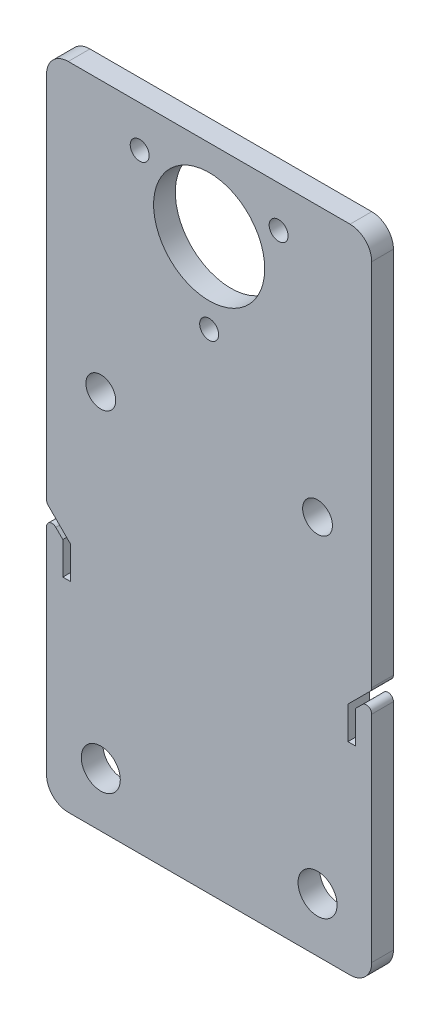
ISO-10303-21;
HEADER;
FILE_DESCRIPTION(('STEP AP214'),'2;1');
FILE_NAME('part.step','',(''),(''),'','','');
FILE_SCHEMA(('AUTOMOTIVE_DESIGN { 1 0 10303 214 1 1 1 1 }'));
ENDSEC;
DATA;
#1=APPLICATION_CONTEXT('core data for automotive mechanical design processes');
#2=APPLICATION_PROTOCOL_DEFINITION('international standard','automotive_design',2000,#1);
#3=PRODUCT_CONTEXT('',#1,'mechanical');
#4=PRODUCT('Part','Part','',(#3));
#5=PRODUCT_RELATED_PRODUCT_CATEGORY('part','',(#4));
#6=PRODUCT_DEFINITION_FORMATION('','',#4);
#7=PRODUCT_DEFINITION_CONTEXT('part definition',#1,'design');
#8=PRODUCT_DEFINITION('design','',#6,#7);
#9=PRODUCT_DEFINITION_SHAPE('','',#8);
#10=(LENGTH_UNIT() NAMED_UNIT(*) SI_UNIT(.MILLI.,.METRE.));
#11=(NAMED_UNIT(*) PLANE_ANGLE_UNIT() SI_UNIT($,.RADIAN.));
#12=(NAMED_UNIT(*) SI_UNIT($,.STERADIAN.) SOLID_ANGLE_UNIT());
#13=UNCERTAINTY_MEASURE_WITH_UNIT(LENGTH_MEASURE(1.E-05),#10,'distance_accuracy_value','');
#14=(GEOMETRIC_REPRESENTATION_CONTEXT(3) GLOBAL_UNCERTAINTY_ASSIGNED_CONTEXT((#13)) GLOBAL_UNIT_ASSIGNED_CONTEXT((#10,
#11,#12)) REPRESENTATION_CONTEXT('',''));
#15=CARTESIAN_POINT('',(0.,0.,0.));
#16=DIRECTION('',(0.,0.,1.));
#17=DIRECTION('',(1.,0.,0.));
#18=AXIS2_PLACEMENT_3D('',#15,#16,#17);
#19=CARTESIAN_POINT('',(0.,0.,4.));
#20=DIRECTION('',(0.,0.,-1.));
#21=DIRECTION('',(-1.,0.,0.));
#22=AXIS2_PLACEMENT_3D('',#19,#20,#21);
#23=PLANE('',#22);
#24=CARTESIAN_POINT('',(-0.884068038830248,45.7063351268432,4.));
#25=DIRECTION('',(0.,0.,1.));
#26=DIRECTION('',(1.,0.,0.));
#27=AXIS2_PLACEMENT_3D('',#24,#25,#26);
#28=CIRCLE('',#27,2.75);
#29=CARTESIAN_POINT('',(1.86593196116975,45.7063351268432,4.));
#30=VERTEX_POINT('',#29);
#31=EDGE_CURVE('E304',#30,#30,#28,.T.);
#32=ORIENTED_EDGE('',*,*,#31,.F.);
#33=EDGE_LOOP('',(#32));
#34=FACE_BOUND('',#33,.T.);
#35=CARTESIAN_POINT('',(-0.884068038830246,-14.4936648731568,4.));
#36=DIRECTION('',(0.,0.,1.));
#37=DIRECTION('',(1.,0.,0.));
#38=AXIS2_PLACEMENT_3D('',#35,#36,#37);
#39=CIRCLE('',#38,3.6);
#40=CARTESIAN_POINT('',(2.71593196116975,-14.4936648731568,4.));
#41=VERTEX_POINT('',#40);
#42=EDGE_CURVE('E298',#41,#41,#39,.T.);
#43=ORIENTED_EDGE('',*,*,#42,.F.);
#44=EDGE_LOOP('',(#43));
#45=FACE_BOUND('',#44,.T.);
#46=CARTESIAN_POINT('',(39.1159319611697,-14.4936648731568,4.));
#47=DIRECTION('',(0.,0.,1.));
#48=DIRECTION('',(1.,0.,0.));
#49=AXIS2_PLACEMENT_3D('',#46,#47,#48);
#50=CIRCLE('',#49,3.6);
#51=CARTESIAN_POINT('',(42.7159319611697,-14.4936648731568,4.));
#52=VERTEX_POINT('',#51);
#53=EDGE_CURVE('E292',#52,#52,#50,.T.);
#54=ORIENTED_EDGE('',*,*,#53,.F.);
#55=EDGE_LOOP('',(#54));
#56=FACE_BOUND('',#55,.T.);
#57=CARTESIAN_POINT('',(39.1159319611697,45.7063351268432,4.));
#58=DIRECTION('',(0.,0.,1.));
#59=DIRECTION('',(1.,0.,0.));
#60=AXIS2_PLACEMENT_3D('',#57,#58,#59);
#61=CIRCLE('',#60,2.75);
#62=CARTESIAN_POINT('',(41.8659319611697,45.7063351268432,4.));
#63=VERTEX_POINT('',#62);
#64=EDGE_CURVE('E286',#63,#63,#61,.T.);
#65=ORIENTED_EDGE('',*,*,#64,.F.);
#66=EDGE_LOOP('',(#65));
#67=FACE_BOUND('',#66,.T.);
#68=CARTESIAN_POINT('',(19.1159319611697,80.5063351268432,4.));
#69=DIRECTION('',(0.,0.,1.));
#70=DIRECTION('',(1.,0.,0.));
#71=AXIS2_PLACEMENT_3D('',#68,#69,#70);
#72=CIRCLE('',#71,10.25);
#73=CARTESIAN_POINT('',(29.3659319611697,80.5063351268432,4.));
#74=VERTEX_POINT('',#73);
#75=EDGE_CURVE('E280',#74,#74,#72,.T.);
#76=ORIENTED_EDGE('',*,*,#75,.F.);
#77=EDGE_LOOP('',(#76));
#78=FACE_BOUND('',#77,.T.);
#79=CARTESIAN_POINT('',(6.29875598516008,87.9063351268432,4.));
#80=DIRECTION('',(0.,0.,1.));
#81=DIRECTION('',(1.,0.,0.));
#82=AXIS2_PLACEMENT_3D('',#79,#80,#81);
#83=CIRCLE('',#82,1.75000000000001);
#84=CARTESIAN_POINT('',(8.0487559851601,87.9063351268432,4.));
#85=VERTEX_POINT('',#84);
#86=EDGE_CURVE('E274',#85,#85,#83,.T.);
#87=ORIENTED_EDGE('',*,*,#86,.F.);
#88=EDGE_LOOP('',(#87));
#89=FACE_BOUND('',#88,.T.);
#90=CARTESIAN_POINT('',(31.9331079371794,87.9063351268432,4.));
#91=DIRECTION('',(0.,0.,1.));
#92=DIRECTION('',(1.,0.,0.));
#93=AXIS2_PLACEMENT_3D('',#90,#91,#92);
#94=CIRCLE('',#93,1.75);
#95=CARTESIAN_POINT('',(33.6831079371794,87.9063351268432,4.));
#96=VERTEX_POINT('',#95);
#97=EDGE_CURVE('E268',#96,#96,#94,.T.);
#98=ORIENTED_EDGE('',*,*,#97,.F.);
#99=EDGE_LOOP('',(#98));
#100=FACE_BOUND('',#99,.T.);
#101=CARTESIAN_POINT('',(19.1159319611697,65.7063351268432,4.));
#102=DIRECTION('',(0.,0.,1.));
#103=DIRECTION('',(1.,0.,0.));
#104=AXIS2_PLACEMENT_3D('',#101,#102,#103);
#105=CIRCLE('',#104,1.75);
#106=CARTESIAN_POINT('',(20.8659319611698,65.7063351268432,4.));
#107=VERTEX_POINT('',#106);
#108=EDGE_CURVE('E262',#107,#107,#105,.T.);
#109=ORIENTED_EDGE('',*,*,#108,.F.);
#110=EDGE_LOOP('',(#109));
#111=FACE_BOUND('',#110,.T.);
#112=DIRECTION('',(0.,-1.,0.));
#113=VECTOR('',#112,1.);
#114=CARTESIAN_POINT('',(-10.8840680388302,-24.4936648731568,4.));
#115=LINE('',#114,#113);
#116=CARTESIAN_POINT('',(-10.8840680388302,91.5063351268432,4.));
#117=VERTEX_POINT('',#116);
#118=CARTESIAN_POINT('',(-10.8840680388302,23.4205486892163,4.));
#119=VERTEX_POINT('',#118);
#120=EDGE_CURVE('E310',#117,#119,#115,.T.);
#121=ORIENTED_EDGE('',*,*,#120,.T.);
#122=CARTESIAN_POINT('',(-9.88406803883025,23.4205486892163,4.));
#123=DIRECTION('',(0.,0.,-1.));
#124=DIRECTION('',(-1.,0.,0.));
#125=AXIS2_PLACEMENT_3D('',#122,#123,#124);
#126=CIRCLE('',#125,1.);
#127=CARTESIAN_POINT('',(-10.5911748200168,22.7134419080298,4.));
#128=VERTEX_POINT('',#127);
#129=EDGE_CURVE('E199',#119,#128,#126,.F.);
#130=ORIENTED_EDGE('',*,*,#129,.T.);
#131=DIRECTION('',(0.707106781186544,-0.707106781186551,0.));
#132=VECTOR('',#131,1.);
#133=CARTESIAN_POINT('',(6.06113354400643,6.06113354400636,4.));
#134=LINE('',#133,#132);
#135=CARTESIAN_POINT('',(-6.48406803883025,18.6063351268432,4.));
#136=VERTEX_POINT('',#135);
#137=EDGE_CURVE('E192',#128,#136,#134,.T.);
#138=ORIENTED_EDGE('',*,*,#137,.T.);
#139=DIRECTION('',(0.,-1.,0.));
#140=VECTOR('',#139,1.);
#141=CARTESIAN_POINT('',(-6.48406803883025,0.,4.));
#142=LINE('',#141,#140);
#143=CARTESIAN_POINT('',(-6.48406803883025,12.6063351268432,4.));
#144=VERTEX_POINT('',#143);
#145=EDGE_CURVE('E197',#136,#144,#142,.T.);
#146=ORIENTED_EDGE('',*,*,#145,.T.);
#147=DIRECTION('',(1.,0.,0.));
#148=VECTOR('',#147,1.);
#149=CARTESIAN_POINT('',(0.,12.6063351268432,4.));
#150=LINE('',#149,#148);
#151=CARTESIAN_POINT('',(-7.88406803883025,12.6063351268432,4.));
#152=VERTEX_POINT('',#151);
#153=EDGE_CURVE('E213',#152,#144,#150,.T.);
#154=ORIENTED_EDGE('',*,*,#153,.F.);
#155=DIRECTION('',(0.,-1.,0.));
#156=VECTOR('',#155,1.);
#157=CARTESIAN_POINT('',(-7.88406803883025,0.,4.));
#158=LINE('',#157,#156);
#159=CARTESIAN_POINT('',(-7.88406803883025,18.6063351268432,4.));
#160=VERTEX_POINT('',#159);
#161=EDGE_CURVE('E226',#160,#152,#158,.T.);
#162=ORIENTED_EDGE('',*,*,#161,.F.);
#163=DIRECTION('',(-0.707106781186544,0.707106781186551,0.));
#164=VECTOR('',#163,1.);
#165=CARTESIAN_POINT('',(5.36113354400642,5.36113354400637,4.));
#166=LINE('',#165,#164);
#167=CARTESIAN_POINT('',(-9.1769612576437,19.8992283456566,4.));
#168=VERTEX_POINT('',#167);
#169=EDGE_CURVE('E203',#160,#168,#166,.T.);
#170=ORIENTED_EDGE('',*,*,#169,.T.);
#171=CARTESIAN_POINT('',(-9.88406803883025,19.1921215644701,4.));
#172=DIRECTION('',(0.,0.,-1.));
#173=DIRECTION('',(-1.,0.,0.));
#174=AXIS2_PLACEMENT_3D('',#171,#172,#173);
#175=CIRCLE('',#174,1.);
#176=CARTESIAN_POINT('',(-10.8840680388302,19.1921215644701,4.));
#177=VERTEX_POINT('',#176);
#178=EDGE_CURVE('E48',#168,#177,#175,.F.);
#179=ORIENTED_EDGE('',*,*,#178,.T.);
#180=CARTESIAN_POINT('',(-10.8840680388302,-20.4936648731568,4.));
#181=VERTEX_POINT('',#180);
#182=EDGE_CURVE('E313',#177,#181,#115,.T.);
#183=ORIENTED_EDGE('',*,*,#182,.T.);
#184=CARTESIAN_POINT('',(-6.88406803883025,-20.4936648731568,4.));
#185=DIRECTION('',(0.,0.,-1.));
#186=DIRECTION('',(-1.,0.,0.));
#187=AXIS2_PLACEMENT_3D('',#184,#185,#186);
#188=CIRCLE('',#187,4.);
#189=CARTESIAN_POINT('',(-6.88406803883025,-24.4936648731568,4.));
#190=VERTEX_POINT('',#189);
#191=EDGE_CURVE('E359',#181,#190,#188,.F.);
#192=ORIENTED_EDGE('',*,*,#191,.T.);
#193=DIRECTION('',(1.,0.,0.));
#194=VECTOR('',#193,1.);
#195=CARTESIAN_POINT('',(-10.8840680388302,-24.4936648731568,4.));
#196=LINE('',#195,#194);
#197=CARTESIAN_POINT('',(45.1159319611697,-24.4936648731568,4.));
#198=VERTEX_POINT('',#197);
#199=EDGE_CURVE('E312',#190,#198,#196,.T.);
#200=ORIENTED_EDGE('',*,*,#199,.T.);
#201=CARTESIAN_POINT('',(45.1159319611697,-20.4936648731568,4.));
#202=DIRECTION('',(0.,0.,-1.));
#203=DIRECTION('',(-1.,0.,0.));
#204=AXIS2_PLACEMENT_3D('',#201,#202,#203);
#205=CIRCLE('',#204,4.);
#206=CARTESIAN_POINT('',(49.1159319611697,-20.4936648731568,4.));
#207=VERTEX_POINT('',#206);
#208=EDGE_CURVE('E361',#198,#207,#205,.F.);
#209=ORIENTED_EDGE('',*,*,#208,.T.);
#210=DIRECTION('',(0.,1.,0.));
#211=VECTOR('',#210,1.);
#212=CARTESIAN_POINT('',(49.1159319611697,-24.4936648731568,4.));
#213=LINE('',#212,#211);
#214=CARTESIAN_POINT('',(49.1159319611697,19.1921215644701,4.));
#215=VERTEX_POINT('',#214);
#216=EDGE_CURVE('E317',#207,#215,#213,.T.);
#217=ORIENTED_EDGE('',*,*,#216,.T.);
#218=CARTESIAN_POINT('',(48.1159319611697,19.1921215644701,4.));
#219=DIRECTION('',(0.,0.,-1.));
#220=DIRECTION('',(-1.,0.,0.));
#221=AXIS2_PLACEMENT_3D('',#218,#219,#220);
#222=CIRCLE('',#221,1.);
#223=CARTESIAN_POINT('',(47.4088251799832,19.8992283456566,4.));
#224=VERTEX_POINT('',#223);
#225=EDGE_CURVE('E402',#215,#224,#222,.F.);
#226=ORIENTED_EDGE('',*,*,#225,.T.);
#227=DIRECTION('',(-0.707106781186548,-0.707106781186547,0.));
#228=VECTOR('',#227,1.);
#229=CARTESIAN_POINT('',(13.7547984171632,-13.7547984171633,4.));
#230=LINE('',#229,#228);
#231=CARTESIAN_POINT('',(46.1159319611697,18.6063351268432,4.));
#232=VERTEX_POINT('',#231);
#233=EDGE_CURVE('E247',#224,#232,#230,.T.);
#234=ORIENTED_EDGE('',*,*,#233,.T.);
#235=DIRECTION('',(0.,-1.,0.));
#236=VECTOR('',#235,1.);
#237=CARTESIAN_POINT('',(46.1159319611697,0.,4.));
#238=LINE('',#237,#236);
#239=CARTESIAN_POINT('',(46.1159319611697,12.6063351268432,4.));
#240=VERTEX_POINT('',#239);
#241=EDGE_CURVE('E244',#232,#240,#238,.T.);
#242=ORIENTED_EDGE('',*,*,#241,.T.);
#243=DIRECTION('',(1.,0.,0.));
#244=VECTOR('',#243,1.);
#245=CARTESIAN_POINT('',(0.,12.6063351268431,4.));
#246=LINE('',#245,#244);
#247=CARTESIAN_POINT('',(44.7159319611698,12.6063351268432,4.));
#248=VERTEX_POINT('',#247);
#249=EDGE_CURVE('E241',#248,#240,#246,.T.);
#250=ORIENTED_EDGE('',*,*,#249,.F.);
#251=DIRECTION('',(0.,-1.,0.));
#252=VECTOR('',#251,1.);
#253=CARTESIAN_POINT('',(44.7159319611698,0.,4.));
#254=LINE('',#253,#252);
#255=CARTESIAN_POINT('',(44.7159319611698,18.6063351268432,4.));
#256=VERTEX_POINT('',#255);
#257=EDGE_CURVE('E238',#256,#248,#254,.T.);
#258=ORIENTED_EDGE('',*,*,#257,.F.);
#259=DIRECTION('',(0.707106781186549,0.707106781186546,0.));
#260=VECTOR('',#259,1.);
#261=CARTESIAN_POINT('',(13.0547984171632,-13.0547984171633,4.));
#262=LINE('',#261,#260);
#263=CARTESIAN_POINT('',(48.8230387423563,22.7134419080297,4.));
#264=VERTEX_POINT('',#263);
#265=EDGE_CURVE('E235',#256,#264,#262,.T.);
#266=ORIENTED_EDGE('',*,*,#265,.T.);
#267=CARTESIAN_POINT('',(48.1159319611697,23.4205486892163,4.));
#268=DIRECTION('',(0.,0.,-1.));
#269=DIRECTION('',(-1.,0.,0.));
#270=AXIS2_PLACEMENT_3D('',#267,#268,#269);
#271=CIRCLE('',#270,1.);
#272=CARTESIAN_POINT('',(49.1159319611697,23.4205486892162,4.));
#273=VERTEX_POINT('',#272);
#274=EDGE_CURVE('E400',#264,#273,#271,.F.);
#275=ORIENTED_EDGE('',*,*,#274,.T.);
#276=CARTESIAN_POINT('',(49.1159319611697,91.5063351268432,4.));
#277=VERTEX_POINT('',#276);
#278=EDGE_CURVE('E316',#273,#277,#213,.T.);
#279=ORIENTED_EDGE('',*,*,#278,.T.);
#280=CARTESIAN_POINT('',(45.1159319611697,91.5063351268432,4.));
#281=DIRECTION('',(0.,0.,-1.));
#282=DIRECTION('',(-1.,0.,0.));
#283=AXIS2_PLACEMENT_3D('',#280,#281,#282);
#284=CIRCLE('',#283,4.);
#285=CARTESIAN_POINT('',(45.1159319611697,95.5063351268432,4.));
#286=VERTEX_POINT('',#285);
#287=EDGE_CURVE('E363',#277,#286,#284,.F.);
#288=ORIENTED_EDGE('',*,*,#287,.T.);
#289=DIRECTION('',(-1.,0.,0.));
#290=VECTOR('',#289,1.);
#291=CARTESIAN_POINT('',(-10.8840680388302,95.5063351268432,4.));
#292=LINE('',#291,#290);
#293=CARTESIAN_POINT('',(-6.88406803883025,95.5063351268432,4.));
#294=VERTEX_POINT('',#293);
#295=EDGE_CURVE('E320',#286,#294,#292,.T.);
#296=ORIENTED_EDGE('',*,*,#295,.T.);
#297=CARTESIAN_POINT('',(-6.88406803883025,91.5063351268432,4.));
#298=DIRECTION('',(0.,0.,-1.));
#299=DIRECTION('',(-1.,0.,0.));
#300=AXIS2_PLACEMENT_3D('',#297,#298,#299);
#301=CIRCLE('',#300,4.);
#302=EDGE_CURVE('E357',#294,#117,#301,.F.);
#303=ORIENTED_EDGE('',*,*,#302,.T.);
#304=EDGE_LOOP('',(#121,#130,#138,#146,#154,#162,#170,#179,#183,#192,#200,#209,#217,#226,#234,
#242,#250,#258,#266,#275,#279,#288,#296,#303));
#305=FACE_BOUND('',#304,.T.);
#306=ADVANCED_FACE('F33',(#34,#45,#56,#67,#78,#89,#100,#111,#305),#23,.F.);
#307=CARTESIAN_POINT('',(0.,0.,0.));
#308=DIRECTION('',(0.,0.,-1.));
#309=DIRECTION('',(-1.,0.,0.));
#310=AXIS2_PLACEMENT_3D('',#307,#308,#309);
#311=PLANE('',#310);
#312=CARTESIAN_POINT('',(31.9331079371794,87.9063351268432,0.));
#313=DIRECTION('',(0.,0.,1.));
#314=DIRECTION('',(1.,0.,0.));
#315=AXIS2_PLACEMENT_3D('',#312,#313,#314);
#316=CIRCLE('',#315,1.75);
#317=CARTESIAN_POINT('',(33.6831079371794,87.9063351268432,0.));
#318=VERTEX_POINT('',#317);
#319=EDGE_CURVE('E265',#318,#318,#316,.T.);
#320=ORIENTED_EDGE('',*,*,#319,.T.);
#321=EDGE_LOOP('',(#320));
#322=FACE_BOUND('',#321,.T.);
#323=CARTESIAN_POINT('',(19.1159319611697,80.5063351268432,0.));
#324=DIRECTION('',(0.,0.,1.));
#325=DIRECTION('',(1.,0.,0.));
#326=AXIS2_PLACEMENT_3D('',#323,#324,#325);
#327=CIRCLE('',#326,10.25);
#328=CARTESIAN_POINT('',(29.3659319611697,80.5063351268432,0.));
#329=VERTEX_POINT('',#328);
#330=EDGE_CURVE('E277',#329,#329,#327,.T.);
#331=ORIENTED_EDGE('',*,*,#330,.T.);
#332=EDGE_LOOP('',(#331));
#333=FACE_BOUND('',#332,.T.);
#334=CARTESIAN_POINT('',(39.1159319611697,-14.4936648731568,0.));
#335=DIRECTION('',(0.,0.,1.));
#336=DIRECTION('',(1.,0.,0.));
#337=AXIS2_PLACEMENT_3D('',#334,#335,#336);
#338=CIRCLE('',#337,3.6);
#339=CARTESIAN_POINT('',(42.7159319611697,-14.4936648731568,0.));
#340=VERTEX_POINT('',#339);
#341=EDGE_CURVE('E289',#340,#340,#338,.T.);
#342=ORIENTED_EDGE('',*,*,#341,.T.);
#343=EDGE_LOOP('',(#342));
#344=FACE_BOUND('',#343,.T.);
#345=CARTESIAN_POINT('',(-0.884068038830248,45.7063351268432,0.));
#346=DIRECTION('',(0.,0.,1.));
#347=DIRECTION('',(1.,0.,0.));
#348=AXIS2_PLACEMENT_3D('',#345,#346,#347);
#349=CIRCLE('',#348,2.75);
#350=CARTESIAN_POINT('',(1.86593196116975,45.7063351268432,0.));
#351=VERTEX_POINT('',#350);
#352=EDGE_CURVE('E301',#351,#351,#349,.T.);
#353=ORIENTED_EDGE('',*,*,#352,.T.);
#354=EDGE_LOOP('',(#353));
#355=FACE_BOUND('',#354,.T.);
#356=CARTESIAN_POINT('',(-0.884068038830246,-14.4936648731568,0.));
#357=DIRECTION('',(0.,0.,1.));
#358=DIRECTION('',(1.,0.,0.));
#359=AXIS2_PLACEMENT_3D('',#356,#357,#358);
#360=CIRCLE('',#359,3.6);
#361=CARTESIAN_POINT('',(2.71593196116975,-14.4936648731568,0.));
#362=VERTEX_POINT('',#361);
#363=EDGE_CURVE('E295',#362,#362,#360,.T.);
#364=ORIENTED_EDGE('',*,*,#363,.T.);
#365=EDGE_LOOP('',(#364));
#366=FACE_BOUND('',#365,.T.);
#367=CARTESIAN_POINT('',(39.1159319611697,45.7063351268432,0.));
#368=DIRECTION('',(0.,0.,1.));
#369=DIRECTION('',(1.,0.,0.));
#370=AXIS2_PLACEMENT_3D('',#367,#368,#369);
#371=CIRCLE('',#370,2.75);
#372=CARTESIAN_POINT('',(41.8659319611697,45.7063351268432,0.));
#373=VERTEX_POINT('',#372);
#374=EDGE_CURVE('E283',#373,#373,#371,.T.);
#375=ORIENTED_EDGE('',*,*,#374,.T.);
#376=EDGE_LOOP('',(#375));
#377=FACE_BOUND('',#376,.T.);
#378=CARTESIAN_POINT('',(6.29875598516008,87.9063351268432,0.));
#379=DIRECTION('',(0.,0.,1.));
#380=DIRECTION('',(1.,0.,0.));
#381=AXIS2_PLACEMENT_3D('',#378,#379,#380);
#382=CIRCLE('',#381,1.75000000000001);
#383=CARTESIAN_POINT('',(8.0487559851601,87.9063351268432,0.));
#384=VERTEX_POINT('',#383);
#385=EDGE_CURVE('E271',#384,#384,#382,.T.);
#386=ORIENTED_EDGE('',*,*,#385,.T.);
#387=EDGE_LOOP('',(#386));
#388=FACE_BOUND('',#387,.T.);
#389=CARTESIAN_POINT('',(19.1159319611697,65.7063351268432,0.));
#390=DIRECTION('',(0.,0.,1.));
#391=DIRECTION('',(1.,0.,0.));
#392=AXIS2_PLACEMENT_3D('',#389,#390,#391);
#393=CIRCLE('',#392,1.75);
#394=CARTESIAN_POINT('',(20.8659319611698,65.7063351268432,0.));
#395=VERTEX_POINT('',#394);
#396=EDGE_CURVE('E261',#395,#395,#393,.T.);
#397=ORIENTED_EDGE('',*,*,#396,.T.);
#398=EDGE_LOOP('',(#397));
#399=FACE_BOUND('',#398,.T.);
#400=DIRECTION('',(-0.707106781186544,0.707106781186551,0.));
#401=VECTOR('',#400,1.);
#402=CARTESIAN_POINT('',(6.06113354400643,6.06113354400636,0.));
#403=LINE('',#402,#401);
#404=CARTESIAN_POINT('',(-6.48406803883025,18.6063351268432,0.));
#405=VERTEX_POINT('',#404);
#406=CARTESIAN_POINT('',(-10.5911748200168,22.7134419080298,0.));
#407=VERTEX_POINT('',#406);
#408=EDGE_CURVE('E209',#405,#407,#403,.T.);
#409=ORIENTED_EDGE('',*,*,#408,.T.);
#410=CARTESIAN_POINT('',(-9.88406803883025,23.4205486892163,0.));
#411=DIRECTION('',(0.,0.,-1.));
#412=DIRECTION('',(-1.,0.,0.));
#413=AXIS2_PLACEMENT_3D('',#410,#411,#412);
#414=CIRCLE('',#413,1.);
#415=CARTESIAN_POINT('',(-10.8840680388302,23.4205486892163,0.));
#416=VERTEX_POINT('',#415);
#417=EDGE_CURVE('E413',#407,#416,#414,.T.);
#418=ORIENTED_EDGE('',*,*,#417,.T.);
#419=DIRECTION('',(0.,-1.,0.));
#420=VECTOR('',#419,1.);
#421=CARTESIAN_POINT('',(-10.8840680388302,-24.4936648731568,0.));
#422=LINE('',#421,#420);
#423=CARTESIAN_POINT('',(-10.8840680388302,91.5063351268432,0.));
#424=VERTEX_POINT('',#423);
#425=EDGE_CURVE('E324',#424,#416,#422,.T.);
#426=ORIENTED_EDGE('',*,*,#425,.F.);
#427=CARTESIAN_POINT('',(-6.88406803883025,91.5063351268432,0.));
#428=DIRECTION('',(0.,0.,-1.));
#429=DIRECTION('',(-1.,0.,0.));
#430=AXIS2_PLACEMENT_3D('',#427,#428,#429);
#431=CIRCLE('',#430,4.);
#432=CARTESIAN_POINT('',(-6.88406803883025,95.5063351268432,0.));
#433=VERTEX_POINT('',#432);
#434=EDGE_CURVE('E341',#424,#433,#431,.T.);
#435=ORIENTED_EDGE('',*,*,#434,.T.);
#436=DIRECTION('',(-1.,0.,0.));
#437=VECTOR('',#436,1.);
#438=CARTESIAN_POINT('',(-10.8840680388302,95.5063351268432,0.));
#439=LINE('',#438,#437);
#440=CARTESIAN_POINT('',(45.1159319611697,95.5063351268432,0.));
#441=VERTEX_POINT('',#440);
#442=EDGE_CURVE('E334',#441,#433,#439,.T.);
#443=ORIENTED_EDGE('',*,*,#442,.F.);
#444=CARTESIAN_POINT('',(45.1159319611697,91.5063351268432,0.));
#445=DIRECTION('',(0.,0.,-1.));
#446=DIRECTION('',(-1.,0.,0.));
#447=AXIS2_PLACEMENT_3D('',#444,#445,#446);
#448=CIRCLE('',#447,4.);
#449=CARTESIAN_POINT('',(49.1159319611697,91.5063351268432,0.));
#450=VERTEX_POINT('',#449);
#451=EDGE_CURVE('E348',#441,#450,#448,.T.);
#452=ORIENTED_EDGE('',*,*,#451,.T.);
#453=DIRECTION('',(0.,1.,0.));
#454=VECTOR('',#453,1.);
#455=CARTESIAN_POINT('',(49.1159319611697,-24.4936648731568,0.));
#456=LINE('',#455,#454);
#457=CARTESIAN_POINT('',(49.1159319611697,23.4205486892162,0.));
#458=VERTEX_POINT('',#457);
#459=EDGE_CURVE('E330',#458,#450,#456,.T.);
#460=ORIENTED_EDGE('',*,*,#459,.F.);
#461=CARTESIAN_POINT('',(48.1159319611697,23.4205486892163,0.));
#462=DIRECTION('',(0.,0.,-1.));
#463=DIRECTION('',(-1.,0.,0.));
#464=AXIS2_PLACEMENT_3D('',#461,#462,#463);
#465=CIRCLE('',#464,1.);
#466=CARTESIAN_POINT('',(48.8230387423563,22.7134419080297,0.));
#467=VERTEX_POINT('',#466);
#468=EDGE_CURVE('E394',#458,#467,#465,.T.);
#469=ORIENTED_EDGE('',*,*,#468,.T.);
#470=DIRECTION('',(-0.707106781186549,-0.707106781186546,0.));
#471=VECTOR('',#470,1.);
#472=CARTESIAN_POINT('',(13.0547984171632,-13.0547984171633,0.));
#473=LINE('',#472,#471);
#474=CARTESIAN_POINT('',(44.7159319611698,18.6063351268432,0.));
#475=VERTEX_POINT('',#474);
#476=EDGE_CURVE('E256',#467,#475,#473,.T.);
#477=ORIENTED_EDGE('',*,*,#476,.T.);
#478=DIRECTION('',(0.,1.,0.));
#479=VECTOR('',#478,1.);
#480=CARTESIAN_POINT('',(44.7159319611698,0.,0.));
#481=LINE('',#480,#479);
#482=CARTESIAN_POINT('',(44.7159319611698,12.6063351268432,0.));
#483=VERTEX_POINT('',#482);
#484=EDGE_CURVE('E376',#483,#475,#481,.T.);
#485=ORIENTED_EDGE('',*,*,#484,.F.);
#486=DIRECTION('',(-1.,0.,0.));
#487=VECTOR('',#486,1.);
#488=CARTESIAN_POINT('',(0.,12.6063351268431,0.));
#489=LINE('',#488,#487);
#490=CARTESIAN_POINT('',(46.1159319611697,12.6063351268432,0.));
#491=VERTEX_POINT('',#490);
#492=EDGE_CURVE('E379',#491,#483,#489,.T.);
#493=ORIENTED_EDGE('',*,*,#492,.F.);
#494=DIRECTION('',(0.,1.,0.));
#495=VECTOR('',#494,1.);
#496=CARTESIAN_POINT('',(46.1159319611697,0.,0.));
#497=LINE('',#496,#495);
#498=CARTESIAN_POINT('',(46.1159319611697,18.6063351268432,0.));
#499=VERTEX_POINT('',#498);
#500=EDGE_CURVE('E381',#491,#499,#497,.T.);
#501=ORIENTED_EDGE('',*,*,#500,.T.);
#502=DIRECTION('',(0.707106781186548,0.707106781186547,0.));
#503=VECTOR('',#502,1.);
#504=CARTESIAN_POINT('',(13.7547984171632,-13.7547984171633,0.));
#505=LINE('',#504,#503);
#506=CARTESIAN_POINT('',(47.4088251799832,19.8992283456566,0.));
#507=VERTEX_POINT('',#506);
#508=EDGE_CURVE('E231',#499,#507,#505,.T.);
#509=ORIENTED_EDGE('',*,*,#508,.T.);
#510=CARTESIAN_POINT('',(48.1159319611697,19.1921215644701,0.));
#511=DIRECTION('',(0.,0.,-1.));
#512=DIRECTION('',(-1.,0.,0.));
#513=AXIS2_PLACEMENT_3D('',#510,#511,#512);
#514=CIRCLE('',#513,1.);
#515=CARTESIAN_POINT('',(49.1159319611697,19.1921215644701,0.));
#516=VERTEX_POINT('',#515);
#517=EDGE_CURVE('E396',#507,#516,#514,.T.);
#518=ORIENTED_EDGE('',*,*,#517,.T.);
#519=CARTESIAN_POINT('',(49.1159319611697,-20.4936648731568,0.));
#520=VERTEX_POINT('',#519);
#521=EDGE_CURVE('E331',#520,#516,#456,.T.);
#522=ORIENTED_EDGE('',*,*,#521,.F.);
#523=CARTESIAN_POINT('',(45.1159319611697,-20.4936648731568,0.));
#524=DIRECTION('',(0.,0.,-1.));
#525=DIRECTION('',(-1.,0.,0.));
#526=AXIS2_PLACEMENT_3D('',#523,#524,#525);
#527=CIRCLE('',#526,4.);
#528=CARTESIAN_POINT('',(45.1159319611697,-24.4936648731568,0.));
#529=VERTEX_POINT('',#528);
#530=EDGE_CURVE('E346',#520,#529,#527,.T.);
#531=ORIENTED_EDGE('',*,*,#530,.T.);
#532=DIRECTION('',(1.,0.,0.));
#533=VECTOR('',#532,1.);
#534=CARTESIAN_POINT('',(-10.8840680388302,-24.4936648731568,0.));
#535=LINE('',#534,#533);
#536=CARTESIAN_POINT('',(-6.88406803883025,-24.4936648731568,0.));
#537=VERTEX_POINT('',#536);
#538=EDGE_CURVE('E327',#537,#529,#535,.T.);
#539=ORIENTED_EDGE('',*,*,#538,.F.);
#540=CARTESIAN_POINT('',(-6.88406803883025,-20.4936648731568,0.));
#541=DIRECTION('',(0.,0.,-1.));
#542=DIRECTION('',(-1.,0.,0.));
#543=AXIS2_PLACEMENT_3D('',#540,#541,#542);
#544=CIRCLE('',#543,4.);
#545=CARTESIAN_POINT('',(-10.8840680388302,-20.4936648731568,0.));
#546=VERTEX_POINT('',#545);
#547=EDGE_CURVE('E343',#537,#546,#544,.T.);
#548=ORIENTED_EDGE('',*,*,#547,.T.);
#549=CARTESIAN_POINT('',(-10.8840680388302,19.1921215644701,0.));
#550=VERTEX_POINT('',#549);
#551=EDGE_CURVE('E307',#550,#546,#422,.T.);
#552=ORIENTED_EDGE('',*,*,#551,.F.);
#553=CARTESIAN_POINT('',(-9.88406803883025,19.1921215644701,0.));
#554=DIRECTION('',(0.,0.,-1.));
#555=DIRECTION('',(-1.,0.,0.));
#556=AXIS2_PLACEMENT_3D('',#553,#554,#555);
#557=CIRCLE('',#556,1.);
#558=CARTESIAN_POINT('',(-9.1769612576437,19.8992283456566,0.));
#559=VERTEX_POINT('',#558);
#560=EDGE_CURVE('E411',#550,#559,#557,.T.);
#561=ORIENTED_EDGE('',*,*,#560,.T.);
#562=DIRECTION('',(0.707106781186544,-0.707106781186551,0.));
#563=VECTOR('',#562,1.);
#564=CARTESIAN_POINT('',(5.36113354400642,5.36113354400637,0.));
#565=LINE('',#564,#563);
#566=CARTESIAN_POINT('',(-7.88406803883025,18.6063351268432,0.));
#567=VERTEX_POINT('',#566);
#568=EDGE_CURVE('E259',#559,#567,#565,.T.);
#569=ORIENTED_EDGE('',*,*,#568,.T.);
#570=DIRECTION('',(0.,1.,0.));
#571=VECTOR('',#570,1.);
#572=CARTESIAN_POINT('',(-7.88406803883025,0.,0.));
#573=LINE('',#572,#571);
#574=CARTESIAN_POINT('',(-7.88406803883025,12.6063351268432,0.));
#575=VERTEX_POINT('',#574);
#576=EDGE_CURVE('E388',#575,#567,#573,.T.);
#577=ORIENTED_EDGE('',*,*,#576,.F.);
#578=DIRECTION('',(-1.,0.,0.));
#579=VECTOR('',#578,1.);
#580=CARTESIAN_POINT('',(0.,12.6063351268432,0.));
#581=LINE('',#580,#579);
#582=CARTESIAN_POINT('',(-6.48406803883025,12.6063351268432,0.));
#583=VERTEX_POINT('',#582);
#584=EDGE_CURVE('E386',#583,#575,#581,.T.);
#585=ORIENTED_EDGE('',*,*,#584,.F.);
#586=DIRECTION('',(0.,1.,0.));
#587=VECTOR('',#586,1.);
#588=CARTESIAN_POINT('',(-6.48406803883025,0.,0.));
#589=LINE('',#588,#587);
#590=EDGE_CURVE('E384',#583,#405,#589,.T.);
#591=ORIENTED_EDGE('',*,*,#590,.T.);
#592=EDGE_LOOP('',(#409,#418,#426,#435,#443,#452,#460,#469,#477,#485,#493,#501,#509,#518,#522,
#531,#539,#548,#552,#561,#569,#577,#585,#591));
#593=FACE_BOUND('',#592,.T.);
#594=ADVANCED_FACE('F431',(#322,#333,#344,#355,#366,#377,#388,#399,#593),#311,.T.);
#595=CARTESIAN_POINT('',(-10.8840680388302,-24.4936648731568,4.));
#596=DIRECTION('',(1.,0.,0.));
#597=DIRECTION('',(0.,0.,-1.));
#598=AXIS2_PLACEMENT_3D('',#595,#596,#597);
#599=PLANE('',#598);
#600=ORIENTED_EDGE('',*,*,#182,.F.);
#601=DIRECTION('',(0.,0.,1.));
#602=VECTOR('',#601,1.);
#603=CARTESIAN_POINT('',(-10.8840680388302,19.1921215644701,0.));
#604=LINE('',#603,#602);
#605=EDGE_CURVE('E11',#177,#550,#604,.F.);
#606=ORIENTED_EDGE('',*,*,#605,.T.);
#607=ORIENTED_EDGE('',*,*,#551,.T.);
#608=DIRECTION('',(0.,0.,-1.));
#609=VECTOR('',#608,1.);
#610=CARTESIAN_POINT('',(-10.8840680388302,-20.4936648731568,4.));
#611=LINE('',#610,#609);
#612=EDGE_CURVE('E373',#546,#181,#611,.F.);
#613=ORIENTED_EDGE('',*,*,#612,.T.);
#614=EDGE_LOOP('',(#600,#606,#607,#613));
#615=FACE_BOUND('',#614,.T.);
#616=ADVANCED_FACE('F434',(#615),#599,.F.);
#617=ORIENTED_EDGE('',*,*,#425,.T.);
#618=DIRECTION('',(0.,0.,-1.));
#619=VECTOR('',#618,1.);
#620=CARTESIAN_POINT('',(-10.8840680388302,23.4205486892163,4.));
#621=LINE('',#620,#619);
#622=EDGE_CURVE('E415',#416,#119,#621,.F.);
#623=ORIENTED_EDGE('',*,*,#622,.T.);
#624=ORIENTED_EDGE('',*,*,#120,.F.);
#625=DIRECTION('',(0.,0.,-1.));
#626=VECTOR('',#625,1.);
#627=CARTESIAN_POINT('',(-10.8840680388302,91.5063351268432,4.));
#628=LINE('',#627,#626);
#629=EDGE_CURVE('E370',#117,#424,#628,.T.);
#630=ORIENTED_EDGE('',*,*,#629,.T.);
#631=EDGE_LOOP('',(#617,#623,#624,#630));
#632=FACE_BOUND('',#631,.T.);
#633=ADVANCED_FACE('F505',(#632),#599,.F.);
#634=CARTESIAN_POINT('',(49.1159319611697,-24.4936648731568,4.));
#635=DIRECTION('',(-1.,0.,0.));
#636=DIRECTION('',(0.,0.,1.));
#637=AXIS2_PLACEMENT_3D('',#634,#635,#636);
#638=PLANE('',#637);
#639=ORIENTED_EDGE('',*,*,#278,.F.);
#640=DIRECTION('',(0.,0.,1.));
#641=VECTOR('',#640,1.);
#642=CARTESIAN_POINT('',(49.1159319611697,23.4205486892163,0.));
#643=LINE('',#642,#641);
#644=EDGE_CURVE('E407',#273,#458,#643,.F.);
#645=ORIENTED_EDGE('',*,*,#644,.T.);
#646=ORIENTED_EDGE('',*,*,#459,.T.);
#647=DIRECTION('',(0.,0.,-1.));
#648=VECTOR('',#647,1.);
#649=CARTESIAN_POINT('',(49.1159319611697,91.5063351268432,4.));
#650=LINE('',#649,#648);
#651=EDGE_CURVE('E354',#450,#277,#650,.F.);
#652=ORIENTED_EDGE('',*,*,#651,.T.);
#653=EDGE_LOOP('',(#639,#645,#646,#652));
#654=FACE_BOUND('',#653,.T.);
#655=ADVANCED_FACE('F485',(#654),#638,.F.);
#656=ORIENTED_EDGE('',*,*,#521,.T.);
#657=DIRECTION('',(0.,0.,-1.));
#658=VECTOR('',#657,1.);
#659=CARTESIAN_POINT('',(49.1159319611697,19.1921215644701,4.));
#660=LINE('',#659,#658);
#661=EDGE_CURVE('E398',#516,#215,#660,.F.);
#662=ORIENTED_EDGE('',*,*,#661,.T.);
#663=ORIENTED_EDGE('',*,*,#216,.F.);
#664=DIRECTION('',(0.,0.,-1.));
#665=VECTOR('',#664,1.);
#666=CARTESIAN_POINT('',(49.1159319611697,-20.4936648731568,4.));
#667=LINE('',#666,#665);
#668=EDGE_CURVE('E351',#207,#520,#667,.T.);
#669=ORIENTED_EDGE('',*,*,#668,.T.);
#670=EDGE_LOOP('',(#656,#662,#663,#669));
#671=FACE_BOUND('',#670,.T.);
#672=ADVANCED_FACE('F453',(#671),#638,.F.);
#673=CARTESIAN_POINT('',(-10.8840680388302,-24.4936648731568,4.));
#674=DIRECTION('',(0.,1.,0.));
#675=DIRECTION('',(0.,0.,1.));
#676=AXIS2_PLACEMENT_3D('',#673,#674,#675);
#677=PLANE('',#676);
#678=ORIENTED_EDGE('',*,*,#538,.T.);
#679=DIRECTION('',(0.,0.,-1.));
#680=VECTOR('',#679,1.);
#681=CARTESIAN_POINT('',(45.1159319611697,-24.4936648731568,4.));
#682=LINE('',#681,#680);
#683=EDGE_CURVE('E368',#529,#198,#682,.F.);
#684=ORIENTED_EDGE('',*,*,#683,.T.);
#685=ORIENTED_EDGE('',*,*,#199,.F.);
#686=DIRECTION('',(0.,0.,-1.));
#687=VECTOR('',#686,1.);
#688=CARTESIAN_POINT('',(-6.88406803883025,-24.4936648731568,4.));
#689=LINE('',#688,#687);
#690=EDGE_CURVE('E365',#190,#537,#689,.T.);
#691=ORIENTED_EDGE('',*,*,#690,.T.);
#692=EDGE_LOOP('',(#678,#684,#685,#691));
#693=FACE_BOUND('',#692,.T.);
#694=ADVANCED_FACE('F442',(#693),#677,.F.);
#695=CARTESIAN_POINT('',(-10.8840680388302,95.5063351268432,4.));
#696=DIRECTION('',(0.,-1.,0.));
#697=DIRECTION('',(1.,0.,0.));
#698=AXIS2_PLACEMENT_3D('',#695,#696,#697);
#699=PLANE('',#698);
#700=ORIENTED_EDGE('',*,*,#295,.F.);
#701=DIRECTION('',(0.,0.,-1.));
#702=VECTOR('',#701,1.);
#703=CARTESIAN_POINT('',(45.1159319611697,95.5063351268432,4.));
#704=LINE('',#703,#702);
#705=EDGE_CURVE('E338',#286,#441,#704,.T.);
#706=ORIENTED_EDGE('',*,*,#705,.T.);
#707=ORIENTED_EDGE('',*,*,#442,.T.);
#708=DIRECTION('',(0.,0.,-1.));
#709=VECTOR('',#708,1.);
#710=CARTESIAN_POINT('',(-6.88406803883025,95.5063351268432,4.));
#711=LINE('',#710,#709);
#712=EDGE_CURVE('E323',#433,#294,#711,.F.);
#713=ORIENTED_EDGE('',*,*,#712,.T.);
#714=EDGE_LOOP('',(#700,#706,#707,#713));
#715=FACE_BOUND('',#714,.T.);
#716=ADVANCED_FACE('F498',(#715),#699,.F.);
#717=CARTESIAN_POINT('',(-0.884068038830248,45.7063351268432,4.));
#718=DIRECTION('',(0.,0.,-1.));
#719=DIRECTION('',(-1.,0.,0.));
#720=AXIS2_PLACEMENT_3D('',#717,#718,#719);
#721=CYLINDRICAL_SURFACE('',#720,2.75);
#722=ORIENTED_EDGE('',*,*,#31,.T.);
#723=EDGE_LOOP('',(#722));
#724=FACE_BOUND('',#723,.T.);
#725=ORIENTED_EDGE('',*,*,#352,.F.);
#726=EDGE_LOOP('',(#725));
#727=FACE_BOUND('',#726,.T.);
#728=ADVANCED_FACE('F532',(#724,#727),#721,.F.);
#729=CARTESIAN_POINT('',(-0.884068038830246,-14.4936648731568,4.));
#730=DIRECTION('',(0.,0.,-1.));
#731=DIRECTION('',(-1.,0.,0.));
#732=AXIS2_PLACEMENT_3D('',#729,#730,#731);
#733=CYLINDRICAL_SURFACE('',#732,3.6);
#734=ORIENTED_EDGE('',*,*,#42,.T.);
#735=EDGE_LOOP('',(#734));
#736=FACE_BOUND('',#735,.T.);
#737=ORIENTED_EDGE('',*,*,#363,.F.);
#738=EDGE_LOOP('',(#737));
#739=FACE_BOUND('',#738,.T.);
#740=ADVANCED_FACE('F741',(#736,#739),#733,.F.);
#741=CARTESIAN_POINT('',(39.1159319611697,-14.4936648731568,4.));
#742=DIRECTION('',(0.,0.,-1.));
#743=DIRECTION('',(-1.,0.,0.));
#744=AXIS2_PLACEMENT_3D('',#741,#742,#743);
#745=CYLINDRICAL_SURFACE('',#744,3.6);
#746=ORIENTED_EDGE('',*,*,#53,.T.);
#747=EDGE_LOOP('',(#746));
#748=FACE_BOUND('',#747,.T.);
#749=ORIENTED_EDGE('',*,*,#341,.F.);
#750=EDGE_LOOP('',(#749));
#751=FACE_BOUND('',#750,.T.);
#752=ADVANCED_FACE('F732',(#748,#751),#745,.F.);
#753=CARTESIAN_POINT('',(39.1159319611697,45.7063351268432,4.));
#754=DIRECTION('',(0.,0.,-1.));
#755=DIRECTION('',(-1.,0.,0.));
#756=AXIS2_PLACEMENT_3D('',#753,#754,#755);
#757=CYLINDRICAL_SURFACE('',#756,2.75);
#758=ORIENTED_EDGE('',*,*,#64,.T.);
#759=EDGE_LOOP('',(#758));
#760=FACE_BOUND('',#759,.T.);
#761=ORIENTED_EDGE('',*,*,#374,.F.);
#762=EDGE_LOOP('',(#761));
#763=FACE_BOUND('',#762,.T.);
#764=ADVANCED_FACE('F723',(#760,#763),#757,.F.);
#765=CARTESIAN_POINT('',(19.1159319611697,80.5063351268432,4.));
#766=DIRECTION('',(0.,0.,-1.));
#767=DIRECTION('',(-1.,0.,0.));
#768=AXIS2_PLACEMENT_3D('',#765,#766,#767);
#769=CYLINDRICAL_SURFACE('',#768,10.25);
#770=ORIENTED_EDGE('',*,*,#75,.T.);
#771=EDGE_LOOP('',(#770));
#772=FACE_BOUND('',#771,.T.);
#773=ORIENTED_EDGE('',*,*,#330,.F.);
#774=EDGE_LOOP('',(#773));
#775=FACE_BOUND('',#774,.T.);
#776=ADVANCED_FACE('F714',(#772,#775),#769,.F.);
#777=CARTESIAN_POINT('',(6.29875598516008,87.9063351268432,4.));
#778=DIRECTION('',(0.,0.,-1.));
#779=DIRECTION('',(-1.,0.,0.));
#780=AXIS2_PLACEMENT_3D('',#777,#778,#779);
#781=CYLINDRICAL_SURFACE('',#780,1.75000000000001);
#782=ORIENTED_EDGE('',*,*,#86,.T.);
#783=EDGE_LOOP('',(#782));
#784=FACE_BOUND('',#783,.T.);
#785=ORIENTED_EDGE('',*,*,#385,.F.);
#786=EDGE_LOOP('',(#785));
#787=FACE_BOUND('',#786,.T.);
#788=ADVANCED_FACE('F705',(#784,#787),#781,.F.);
#789=CARTESIAN_POINT('',(31.9331079371794,87.9063351268432,4.));
#790=DIRECTION('',(0.,0.,-1.));
#791=DIRECTION('',(-1.,0.,0.));
#792=AXIS2_PLACEMENT_3D('',#789,#790,#791);
#793=CYLINDRICAL_SURFACE('',#792,1.75);
#794=ORIENTED_EDGE('',*,*,#97,.T.);
#795=EDGE_LOOP('',(#794));
#796=FACE_BOUND('',#795,.T.);
#797=ORIENTED_EDGE('',*,*,#319,.F.);
#798=EDGE_LOOP('',(#797));
#799=FACE_BOUND('',#798,.T.);
#800=ADVANCED_FACE('F695',(#796,#799),#793,.F.);
#801=CARTESIAN_POINT('',(19.1159319611697,65.7063351268432,4.));
#802=DIRECTION('',(0.,0.,-1.));
#803=DIRECTION('',(-1.,0.,0.));
#804=AXIS2_PLACEMENT_3D('',#801,#802,#803);
#805=CYLINDRICAL_SURFACE('',#804,1.75);
#806=ORIENTED_EDGE('',*,*,#108,.T.);
#807=EDGE_LOOP('',(#806));
#808=FACE_BOUND('',#807,.T.);
#809=ORIENTED_EDGE('',*,*,#396,.F.);
#810=EDGE_LOOP('',(#809));
#811=FACE_BOUND('',#810,.T.);
#812=ADVANCED_FACE('F545',(#808,#811),#805,.F.);
#813=CARTESIAN_POINT('',(45.1159319611697,91.5063351268432,4.));
#814=DIRECTION('',(0.,0.,-1.));
#815=DIRECTION('',(-1.,0.,0.));
#816=AXIS2_PLACEMENT_3D('',#813,#814,#815);
#817=CYLINDRICAL_SURFACE('',#816,4.);
#818=ORIENTED_EDGE('',*,*,#287,.F.);
#819=ORIENTED_EDGE('',*,*,#651,.F.);
#820=ORIENTED_EDGE('',*,*,#451,.F.);
#821=ORIENTED_EDGE('',*,*,#705,.F.);
#822=EDGE_LOOP('',(#818,#819,#820,#821));
#823=FACE_BOUND('',#822,.T.);
#824=ADVANCED_FACE('F494',(#823),#817,.T.);
#825=CARTESIAN_POINT('',(45.1159319611697,-20.4936648731568,4.));
#826=DIRECTION('',(0.,0.,-1.));
#827=DIRECTION('',(-1.,0.,0.));
#828=AXIS2_PLACEMENT_3D('',#825,#826,#827);
#829=CYLINDRICAL_SURFACE('',#828,4.);
#830=ORIENTED_EDGE('',*,*,#208,.F.);
#831=ORIENTED_EDGE('',*,*,#683,.F.);
#832=ORIENTED_EDGE('',*,*,#530,.F.);
#833=ORIENTED_EDGE('',*,*,#668,.F.);
#834=EDGE_LOOP('',(#830,#831,#832,#833));
#835=FACE_BOUND('',#834,.T.);
#836=ADVANCED_FACE('F448',(#835),#829,.T.);
#837=CARTESIAN_POINT('',(-6.88406803883025,-20.4936648731568,4.));
#838=DIRECTION('',(0.,0.,-1.));
#839=DIRECTION('',(-1.,0.,0.));
#840=AXIS2_PLACEMENT_3D('',#837,#838,#839);
#841=CYLINDRICAL_SURFACE('',#840,4.);
#842=ORIENTED_EDGE('',*,*,#191,.F.);
#843=ORIENTED_EDGE('',*,*,#612,.F.);
#844=ORIENTED_EDGE('',*,*,#547,.F.);
#845=ORIENTED_EDGE('',*,*,#690,.F.);
#846=EDGE_LOOP('',(#842,#843,#844,#845));
#847=FACE_BOUND('',#846,.T.);
#848=ADVANCED_FACE('F445',(#847),#841,.T.);
#849=CARTESIAN_POINT('',(-6.88406803883025,91.5063351268432,4.));
#850=DIRECTION('',(0.,0.,-1.));
#851=DIRECTION('',(-1.,0.,0.));
#852=AXIS2_PLACEMENT_3D('',#849,#850,#851);
#853=CYLINDRICAL_SURFACE('',#852,4.);
#854=ORIENTED_EDGE('',*,*,#302,.F.);
#855=ORIENTED_EDGE('',*,*,#712,.F.);
#856=ORIENTED_EDGE('',*,*,#434,.F.);
#857=ORIENTED_EDGE('',*,*,#629,.F.);
#858=EDGE_LOOP('',(#854,#855,#856,#857));
#859=FACE_BOUND('',#858,.T.);
#860=ADVANCED_FACE('F501',(#859),#853,.T.);
#861=CARTESIAN_POINT('',(13.0547984171632,-13.0547984171633,-6.));
#862=DIRECTION('',(0.707106781186546,-0.707106781186549,0.));
#863=DIRECTION('',(0.707106781186549,0.707106781186546,0.));
#864=AXIS2_PLACEMENT_3D('',#861,#862,#863);
#865=PLANE('',#864);
#866=ORIENTED_EDGE('',*,*,#476,.F.);
#867=DIRECTION('',(0.,0.,1.));
#868=VECTOR('',#867,1.);
#869=CARTESIAN_POINT('',(48.8230387423563,22.7134419080297,4.));
#870=LINE('',#869,#868);
#871=EDGE_CURVE('E404',#467,#264,#870,.T.);
#872=ORIENTED_EDGE('',*,*,#871,.T.);
#873=ORIENTED_EDGE('',*,*,#265,.F.);
#874=DIRECTION('',(0.,0.,1.));
#875=VECTOR('',#874,1.);
#876=CARTESIAN_POINT('',(44.7159319611698,18.6063351268432,-6.));
#877=LINE('',#876,#875);
#878=EDGE_CURVE('E248',#475,#256,#877,.T.);
#879=ORIENTED_EDGE('',*,*,#878,.F.);
#880=EDGE_LOOP('',(#866,#872,#873,#879));
#881=FACE_BOUND('',#880,.T.);
#882=ADVANCED_FACE('F479',(#881),#865,.T.);
#883=CARTESIAN_POINT('',(13.7547984171632,-13.7547984171633,-6.));
#884=DIRECTION('',(-0.707106781186547,0.707106781186548,0.));
#885=DIRECTION('',(-0.707106781186548,-0.707106781186547,0.));
#886=AXIS2_PLACEMENT_3D('',#883,#884,#885);
#887=PLANE('',#886);
#888=ORIENTED_EDGE('',*,*,#233,.F.);
#889=DIRECTION('',(0.,0.,-1.));
#890=VECTOR('',#889,1.);
#891=CARTESIAN_POINT('',(47.4088251799832,19.8992283456566,0.));
#892=LINE('',#891,#890);
#893=EDGE_CURVE('E391',#224,#507,#892,.T.);
#894=ORIENTED_EDGE('',*,*,#893,.T.);
#895=ORIENTED_EDGE('',*,*,#508,.F.);
#896=DIRECTION('',(0.,0.,1.));
#897=VECTOR('',#896,1.);
#898=CARTESIAN_POINT('',(46.1159319611697,18.6063351268432,-6.));
#899=LINE('',#898,#897);
#900=EDGE_CURVE('E219',#499,#232,#899,.T.);
#901=ORIENTED_EDGE('',*,*,#900,.T.);
#902=EDGE_LOOP('',(#888,#894,#895,#901));
#903=FACE_BOUND('',#902,.T.);
#904=ADVANCED_FACE('F460',(#903),#887,.T.);
#905=CARTESIAN_POINT('',(46.1159319611697,0.,-6.));
#906=DIRECTION('',(-1.,0.,0.));
#907=DIRECTION('',(0.,0.,1.));
#908=AXIS2_PLACEMENT_3D('',#905,#906,#907);
#909=PLANE('',#908);
#910=DIRECTION('',(0.,0.,1.));
#911=VECTOR('',#910,1.);
#912=CARTESIAN_POINT('',(46.1159319611697,12.6063351268432,-6.));
#913=LINE('',#912,#911);
#914=EDGE_CURVE('E222',#491,#240,#913,.T.);
#915=ORIENTED_EDGE('',*,*,#914,.T.);
#916=ORIENTED_EDGE('',*,*,#241,.F.);
#917=ORIENTED_EDGE('',*,*,#900,.F.);
#918=ORIENTED_EDGE('',*,*,#500,.F.);
#919=EDGE_LOOP('',(#915,#916,#917,#918));
#920=FACE_BOUND('',#919,.T.);
#921=ADVANCED_FACE('F464',(#920),#909,.T.);
#922=CARTESIAN_POINT('',(0.,12.6063351268431,-6.));
#923=DIRECTION('',(0.,-1.,0.));
#924=DIRECTION('',(1.,0.,0.));
#925=AXIS2_PLACEMENT_3D('',#922,#923,#924);
#926=PLANE('',#925);
#927=ORIENTED_EDGE('',*,*,#492,.T.);
#928=DIRECTION('',(0.,0.,1.));
#929=VECTOR('',#928,1.);
#930=CARTESIAN_POINT('',(44.7159319611698,12.6063351268432,-6.));
#931=LINE('',#930,#929);
#932=EDGE_CURVE('E251',#483,#248,#931,.T.);
#933=ORIENTED_EDGE('',*,*,#932,.T.);
#934=ORIENTED_EDGE('',*,*,#249,.T.);
#935=ORIENTED_EDGE('',*,*,#914,.F.);
#936=EDGE_LOOP('',(#927,#933,#934,#935));
#937=FACE_BOUND('',#936,.T.);
#938=ADVANCED_FACE('F469',(#937),#926,.F.);
#939=CARTESIAN_POINT('',(44.7159319611698,0.,-6.));
#940=DIRECTION('',(-1.,0.,0.));
#941=DIRECTION('',(0.,0.,1.));
#942=AXIS2_PLACEMENT_3D('',#939,#940,#941);
#943=PLANE('',#942);
#944=ORIENTED_EDGE('',*,*,#484,.T.);
#945=ORIENTED_EDGE('',*,*,#878,.T.);
#946=ORIENTED_EDGE('',*,*,#257,.T.);
#947=ORIENTED_EDGE('',*,*,#932,.F.);
#948=EDGE_LOOP('',(#944,#945,#946,#947));
#949=FACE_BOUND('',#948,.T.);
#950=ADVANCED_FACE('F474',(#949),#943,.F.);
#951=CARTESIAN_POINT('',(-6.48406803883025,0.,-6.));
#952=DIRECTION('',(-1.,0.,0.));
#953=DIRECTION('',(0.,0.,1.));
#954=AXIS2_PLACEMENT_3D('',#951,#952,#953);
#955=PLANE('',#954);
#956=DIRECTION('',(0.,0.,1.));
#957=VECTOR('',#956,1.);
#958=CARTESIAN_POINT('',(-6.48406803883025,12.6063351268432,-6.));
#959=LINE('',#958,#957);
#960=EDGE_CURVE('E217',#583,#144,#959,.T.);
#961=ORIENTED_EDGE('',*,*,#960,.T.);
#962=ORIENTED_EDGE('',*,*,#145,.F.);
#963=DIRECTION('',(0.,0.,1.));
#964=VECTOR('',#963,1.);
#965=CARTESIAN_POINT('',(-6.48406803883025,18.6063351268432,-6.));
#966=LINE('',#965,#964);
#967=EDGE_CURVE('E206',#405,#136,#966,.T.);
#968=ORIENTED_EDGE('',*,*,#967,.F.);
#969=ORIENTED_EDGE('',*,*,#590,.F.);
#970=EDGE_LOOP('',(#961,#962,#968,#969));
#971=FACE_BOUND('',#970,.T.);
#972=ADVANCED_FACE('F215',(#971),#955,.T.);
#973=CARTESIAN_POINT('',(0.,12.6063351268432,-6.));
#974=DIRECTION('',(0.,-1.,0.));
#975=DIRECTION('',(0.,0.,-1.));
#976=AXIS2_PLACEMENT_3D('',#973,#974,#975);
#977=PLANE('',#976);
#978=ORIENTED_EDGE('',*,*,#584,.T.);
#979=DIRECTION('',(0.,0.,1.));
#980=VECTOR('',#979,1.);
#981=CARTESIAN_POINT('',(-7.88406803883025,12.6063351268432,-6.));
#982=LINE('',#981,#980);
#983=EDGE_CURVE('E232',#575,#152,#982,.T.);
#984=ORIENTED_EDGE('',*,*,#983,.T.);
#985=ORIENTED_EDGE('',*,*,#153,.T.);
#986=ORIENTED_EDGE('',*,*,#960,.F.);
#987=EDGE_LOOP('',(#978,#984,#985,#986));
#988=FACE_BOUND('',#987,.T.);
#989=ADVANCED_FACE('F511',(#988),#977,.F.);
#990=CARTESIAN_POINT('',(-7.88406803883025,0.,-6.));
#991=DIRECTION('',(-1.,0.,0.));
#992=DIRECTION('',(0.,0.,1.));
#993=AXIS2_PLACEMENT_3D('',#990,#991,#992);
#994=PLANE('',#993);
#995=ORIENTED_EDGE('',*,*,#576,.T.);
#996=DIRECTION('',(0.,0.,1.));
#997=VECTOR('',#996,1.);
#998=CARTESIAN_POINT('',(-7.88406803883025,18.6063351268432,-6.));
#999=LINE('',#998,#997);
#1000=EDGE_CURVE('E212',#567,#160,#999,.T.);
#1001=ORIENTED_EDGE('',*,*,#1000,.T.);
#1002=ORIENTED_EDGE('',*,*,#161,.T.);
#1003=ORIENTED_EDGE('',*,*,#983,.F.);
#1004=EDGE_LOOP('',(#995,#1001,#1002,#1003));
#1005=FACE_BOUND('',#1004,.T.);
#1006=ADVANCED_FACE('F427',(#1005),#994,.F.);
#1007=CARTESIAN_POINT('',(5.36113354400642,5.36113354400637,-6.));
#1008=DIRECTION('',(0.707106781186551,0.707106781186544,0.));
#1009=DIRECTION('',(-0.707106781186544,0.707106781186551,0.));
#1010=AXIS2_PLACEMENT_3D('',#1007,#1008,#1009);
#1011=PLANE('',#1010);
#1012=ORIENTED_EDGE('',*,*,#568,.F.);
#1013=DIRECTION('',(0.,0.,1.));
#1014=VECTOR('',#1013,1.);
#1015=CARTESIAN_POINT('',(-9.1769612576437,19.8992283456566,4.));
#1016=LINE('',#1015,#1014);
#1017=EDGE_CURVE('E41',#559,#168,#1016,.T.);
#1018=ORIENTED_EDGE('',*,*,#1017,.T.);
#1019=ORIENTED_EDGE('',*,*,#169,.F.);
#1020=ORIENTED_EDGE('',*,*,#1000,.F.);
#1021=EDGE_LOOP('',(#1012,#1018,#1019,#1020));
#1022=FACE_BOUND('',#1021,.T.);
#1023=ADVANCED_FACE('F421',(#1022),#1011,.T.);
#1024=CARTESIAN_POINT('',(6.06113354400643,6.06113354400636,-6.));
#1025=DIRECTION('',(-0.707106781186551,-0.707106781186544,0.));
#1026=DIRECTION('',(0.707106781186544,-0.707106781186551,0.));
#1027=AXIS2_PLACEMENT_3D('',#1024,#1025,#1026);
#1028=PLANE('',#1027);
#1029=ORIENTED_EDGE('',*,*,#137,.F.);
#1030=DIRECTION('',(0.,0.,-1.));
#1031=VECTOR('',#1030,1.);
#1032=CARTESIAN_POINT('',(-10.5911748200168,22.7134419080298,0.));
#1033=LINE('',#1032,#1031);
#1034=EDGE_CURVE('E409',#128,#407,#1033,.T.);
#1035=ORIENTED_EDGE('',*,*,#1034,.T.);
#1036=ORIENTED_EDGE('',*,*,#408,.F.);
#1037=ORIENTED_EDGE('',*,*,#967,.T.);
#1038=EDGE_LOOP('',(#1029,#1035,#1036,#1037));
#1039=FACE_BOUND('',#1038,.T.);
#1040=ADVANCED_FACE('F207',(#1039),#1028,.T.);
#1041=CARTESIAN_POINT('',(48.1159319611697,19.1921215644701,-6.));
#1042=DIRECTION('',(0.,0.,1.));
#1043=DIRECTION('',(1.,0.,0.));
#1044=AXIS2_PLACEMENT_3D('',#1041,#1042,#1043);
#1045=CYLINDRICAL_SURFACE('',#1044,1.);
#1046=ORIENTED_EDGE('',*,*,#225,.F.);
#1047=ORIENTED_EDGE('',*,*,#661,.F.);
#1048=ORIENTED_EDGE('',*,*,#517,.F.);
#1049=ORIENTED_EDGE('',*,*,#893,.F.);
#1050=EDGE_LOOP('',(#1046,#1047,#1048,#1049));
#1051=FACE_BOUND('',#1050,.T.);
#1052=ADVANCED_FACE('F456',(#1051),#1045,.T.);
#1053=CARTESIAN_POINT('',(48.1159319611697,23.4205486892163,-6.));
#1054=DIRECTION('',(0.,0.,-1.));
#1055=DIRECTION('',(-1.,0.,0.));
#1056=AXIS2_PLACEMENT_3D('',#1053,#1054,#1055);
#1057=CYLINDRICAL_SURFACE('',#1056,1.);
#1058=ORIENTED_EDGE('',*,*,#468,.F.);
#1059=ORIENTED_EDGE('',*,*,#644,.F.);
#1060=ORIENTED_EDGE('',*,*,#274,.F.);
#1061=ORIENTED_EDGE('',*,*,#871,.F.);
#1062=EDGE_LOOP('',(#1058,#1059,#1060,#1061));
#1063=FACE_BOUND('',#1062,.T.);
#1064=ADVANCED_FACE('F490',(#1063),#1057,.T.);
#1065=CARTESIAN_POINT('',(-9.88406803883025,23.4205486892163,-6.));
#1066=DIRECTION('',(0.,0.,1.));
#1067=DIRECTION('',(1.,0.,0.));
#1068=AXIS2_PLACEMENT_3D('',#1065,#1066,#1067);
#1069=CYLINDRICAL_SURFACE('',#1068,1.);
#1070=ORIENTED_EDGE('',*,*,#129,.F.);
#1071=ORIENTED_EDGE('',*,*,#622,.F.);
#1072=ORIENTED_EDGE('',*,*,#417,.F.);
#1073=ORIENTED_EDGE('',*,*,#1034,.F.);
#1074=EDGE_LOOP('',(#1070,#1071,#1072,#1073));
#1075=FACE_BOUND('',#1074,.T.);
#1076=ADVANCED_FACE('F509',(#1075),#1069,.T.);
#1077=CARTESIAN_POINT('',(-9.88406803883025,19.1921215644701,-6.));
#1078=DIRECTION('',(0.,0.,-1.));
#1079=DIRECTION('',(-1.,0.,0.));
#1080=AXIS2_PLACEMENT_3D('',#1077,#1078,#1079);
#1081=CYLINDRICAL_SURFACE('',#1080,1.);
#1082=ORIENTED_EDGE('',*,*,#560,.F.);
#1083=ORIENTED_EDGE('',*,*,#605,.F.);
#1084=ORIENTED_EDGE('',*,*,#178,.F.);
#1085=ORIENTED_EDGE('',*,*,#1017,.F.);
#1086=EDGE_LOOP('',(#1082,#1083,#1084,#1085));
#1087=FACE_BOUND('',#1086,.T.);
#1088=ADVANCED_FACE('F35',(#1087),#1081,.T.);
#1089=CLOSED_SHELL('',(#306,#594,#616,#633,#655,#672,#694,#716,#728,#740,#752,#764,#776,#788,
#800,#812,#824,#836,#848,#860,#882,#904,#921,#938,#950,#972,#989,#1006,#1023,#1040,#1052,#1064,
#1076,#1088));
#1090=MANIFOLD_SOLID_BREP('B2',#1089);
#1091=ADVANCED_BREP_SHAPE_REPRESENTATION('',(#18,#1090),#14);
#1092=SHAPE_DEFINITION_REPRESENTATION(#9,#1091);
ENDSEC;
END-ISO-10303-21;
